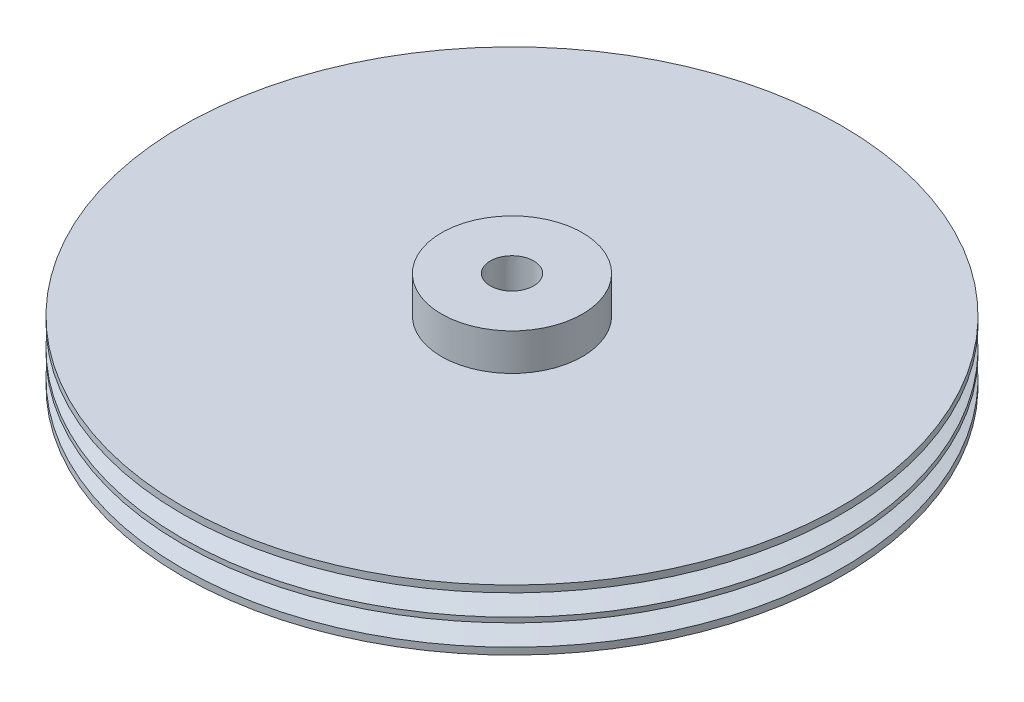
ISO-10303-21;
HEADER;
FILE_DESCRIPTION(('STEP AP214'),'2;1');
FILE_NAME('part.step','',(''),(''),'','','');
FILE_SCHEMA(('AUTOMOTIVE_DESIGN { 1 0 10303 214 1 1 1 1 }'));
ENDSEC;
DATA;
#1=APPLICATION_CONTEXT('core data for automotive mechanical design processes');
#2=APPLICATION_PROTOCOL_DEFINITION('international standard','automotive_design',2000,#1);
#3=PRODUCT_CONTEXT('',#1,'mechanical');
#4=PRODUCT('Part','Part','',(#3));
#5=PRODUCT_RELATED_PRODUCT_CATEGORY('part','',(#4));
#6=PRODUCT_DEFINITION_FORMATION('','',#4);
#7=PRODUCT_DEFINITION_CONTEXT('part definition',#1,'design');
#8=PRODUCT_DEFINITION('design','',#6,#7);
#9=PRODUCT_DEFINITION_SHAPE('','',#8);
#10=(LENGTH_UNIT() NAMED_UNIT(*) SI_UNIT(.MILLI.,.METRE.));
#11=(NAMED_UNIT(*) PLANE_ANGLE_UNIT() SI_UNIT($,.RADIAN.));
#12=(NAMED_UNIT(*) SI_UNIT($,.STERADIAN.) SOLID_ANGLE_UNIT());
#13=UNCERTAINTY_MEASURE_WITH_UNIT(LENGTH_MEASURE(1.E-05),#10,'distance_accuracy_value','');
#14=(GEOMETRIC_REPRESENTATION_CONTEXT(3) GLOBAL_UNCERTAINTY_ASSIGNED_CONTEXT((#13)) GLOBAL_UNIT_ASSIGNED_CONTEXT((#10,
#11,#12)) REPRESENTATION_CONTEXT('',''));
#15=CARTESIAN_POINT('',(0.,0.,0.));
#16=DIRECTION('',(0.,0.,1.));
#17=DIRECTION('',(1.,0.,0.));
#18=AXIS2_PLACEMENT_3D('',#15,#16,#17);
#19=CARTESIAN_POINT('',(10.,0.,0.));
#20=DIRECTION('',(0.,1.,0.));
#21=DIRECTION('',(0.,0.,1.));
#22=AXIS2_PLACEMENT_3D('',#19,#20,#21);
#23=PLANE('',#22);
#24=CARTESIAN_POINT('',(0.,0.,0.));
#25=DIRECTION('',(0.,1.,0.));
#26=DIRECTION('',(0.,0.,1.));
#27=AXIS2_PLACEMENT_3D('',#24,#25,#26);
#28=CIRCLE('',#27,152.);
#29=CARTESIAN_POINT('',(0.,0.,152.));
#30=VERTEX_POINT('',#29);
#31=EDGE_CURVE('E10',#30,#30,#28,.T.);
#32=ORIENTED_EDGE('',*,*,#31,.F.);
#33=EDGE_LOOP('',(#32));
#34=FACE_BOUND('',#33,.T.);
#35=CARTESIAN_POINT('',(0.,0.,0.));
#36=DIRECTION('',(0.,1.,0.));
#37=DIRECTION('',(0.,0.,1.));
#38=AXIS2_PLACEMENT_3D('',#35,#36,#37);
#39=CIRCLE('',#38,10.);
#40=CARTESIAN_POINT('',(0.,0.,10.));
#41=VERTEX_POINT('',#40);
#42=EDGE_CURVE('E78',#41,#41,#39,.T.);
#43=ORIENTED_EDGE('',*,*,#42,.T.);
#44=EDGE_LOOP('',(#43));
#45=FACE_BOUND('',#44,.T.);
#46=ADVANCED_FACE('F32',(#34,#45),#23,.F.);
#47=CARTESIAN_POINT('',(0.,18.7985043090315,0.));
#48=DIRECTION('',(0.,1.,0.));
#49=DIRECTION('',(0.,0.,1.));
#50=AXIS2_PLACEMENT_3D('',#47,#48,#49);
#51=CYLINDRICAL_SURFACE('',#50,152.);
#52=CARTESIAN_POINT('',(0.,3.1385386370827,0.));
#53=DIRECTION('',(0.,1.,0.));
#54=DIRECTION('',(0.,0.,1.));
#55=AXIS2_PLACEMENT_3D('',#52,#53,#54);
#56=CIRCLE('',#55,152.);
#57=CARTESIAN_POINT('',(0.,3.1385386370827,152.));
#58=VERTEX_POINT('',#57);
#59=EDGE_CURVE('E38',#58,#58,#56,.T.);
#60=ORIENTED_EDGE('',*,*,#59,.F.);
#61=EDGE_LOOP('',(#60));
#62=FACE_BOUND('',#61,.T.);
#63=ORIENTED_EDGE('',*,*,#31,.T.);
#64=EDGE_LOOP('',(#63));
#65=FACE_BOUND('',#64,.T.);
#66=ADVANCED_FACE('F151',(#62,#65),#51,.T.);
#67=CARTESIAN_POINT('',(0.,3.1385386370827,0.));
#68=DIRECTION('',(0.,-1.,0.));
#69=DIRECTION('',(0.,0.,-1.));
#70=AXIS2_PLACEMENT_3D('',#67,#68,#69);
#71=CONICAL_SURFACE('',#70,152.,1.27409035395586);
#72=CARTESIAN_POINT('',(0.,6.50157613312794,0.));
#73=DIRECTION('',(0.,1.,0.));
#74=DIRECTION('',(0.,0.,1.));
#75=AXIS2_PLACEMENT_3D('',#72,#73,#74);
#76=CIRCLE('',#75,141.);
#77=CARTESIAN_POINT('',(0.,6.50157613312794,141.));
#78=VERTEX_POINT('',#77);
#79=EDGE_CURVE('E42',#78,#78,#76,.T.);
#80=ORIENTED_EDGE('',*,*,#79,.F.);
#81=EDGE_LOOP('',(#80));
#82=FACE_BOUND('',#81,.T.);
#83=ORIENTED_EDGE('',*,*,#59,.T.);
#84=EDGE_LOOP('',(#83));
#85=FACE_BOUND('',#84,.T.);
#86=ADVANCED_FACE('F146',(#82,#85),#71,.T.);
#87=CARTESIAN_POINT('',(0.,18.7985043090315,0.));
#88=DIRECTION('',(0.,1.,0.));
#89=DIRECTION('',(0.,0.,1.));
#90=AXIS2_PLACEMENT_3D('',#87,#88,#89);
#91=CYLINDRICAL_SURFACE('',#90,141.);
#92=CARTESIAN_POINT('',(0.,9.49842386687209,0.));
#93=DIRECTION('',(0.,1.,0.));
#94=DIRECTION('',(0.,0.,1.));
#95=AXIS2_PLACEMENT_3D('',#92,#93,#94);
#96=CIRCLE('',#95,141.);
#97=CARTESIAN_POINT('',(0.,9.49842386687209,141.));
#98=VERTEX_POINT('',#97);
#99=EDGE_CURVE('E46',#98,#98,#96,.T.);
#100=ORIENTED_EDGE('',*,*,#99,.F.);
#101=EDGE_LOOP('',(#100));
#102=FACE_BOUND('',#101,.T.);
#103=ORIENTED_EDGE('',*,*,#79,.T.);
#104=EDGE_LOOP('',(#103));
#105=FACE_BOUND('',#104,.T.);
#106=ADVANCED_FACE('F140',(#102,#105),#91,.T.);
#107=CARTESIAN_POINT('',(0.,9.49842386687209,0.));
#108=DIRECTION('',(0.,1.,0.));
#109=DIRECTION('',(0.,0.,1.));
#110=AXIS2_PLACEMENT_3D('',#107,#108,#109);
#111=CONICAL_SURFACE('',#110,141.,1.27409035395586);
#112=CARTESIAN_POINT('',(0.,12.8614613629173,0.));
#113=DIRECTION('',(0.,1.,0.));
#114=DIRECTION('',(0.,0.,1.));
#115=AXIS2_PLACEMENT_3D('',#112,#113,#114);
#116=CIRCLE('',#115,152.);
#117=CARTESIAN_POINT('',(0.,12.8614613629173,152.));
#118=VERTEX_POINT('',#117);
#119=EDGE_CURVE('E51',#118,#118,#116,.T.);
#120=ORIENTED_EDGE('',*,*,#119,.F.);
#121=EDGE_LOOP('',(#120));
#122=FACE_BOUND('',#121,.T.);
#123=ORIENTED_EDGE('',*,*,#99,.T.);
#124=EDGE_LOOP('',(#123));
#125=FACE_BOUND('',#124,.T.);
#126=ADVANCED_FACE('F134',(#122,#125),#111,.T.);
#127=CARTESIAN_POINT('',(0.,18.7985043090315,0.));
#128=DIRECTION('',(0.,1.,0.));
#129=DIRECTION('',(0.,0.,1.));
#130=AXIS2_PLACEMENT_3D('',#127,#128,#129);
#131=CYLINDRICAL_SURFACE('',#130,152.);
#132=CARTESIAN_POINT('',(0.,15.1385386370827,0.));
#133=DIRECTION('',(0.,1.,0.));
#134=DIRECTION('',(0.,0.,1.));
#135=AXIS2_PLACEMENT_3D('',#132,#133,#134);
#136=CIRCLE('',#135,152.);
#137=CARTESIAN_POINT('',(0.,15.1385386370827,152.));
#138=VERTEX_POINT('',#137);
#139=EDGE_CURVE('E54',#138,#138,#136,.T.);
#140=ORIENTED_EDGE('',*,*,#139,.F.);
#141=EDGE_LOOP('',(#140));
#142=FACE_BOUND('',#141,.T.);
#143=ORIENTED_EDGE('',*,*,#119,.T.);
#144=EDGE_LOOP('',(#143));
#145=FACE_BOUND('',#144,.T.);
#146=ADVANCED_FACE('F128',(#142,#145),#131,.T.);
#147=CARTESIAN_POINT('',(0.,15.1385386370827,0.));
#148=DIRECTION('',(0.,-1.,0.));
#149=DIRECTION('',(0.,0.,-1.));
#150=AXIS2_PLACEMENT_3D('',#147,#148,#149);
#151=CONICAL_SURFACE('',#150,152.,1.27409035395586);
#152=CARTESIAN_POINT('',(0.,18.5015761331279,0.));
#153=DIRECTION('',(0.,1.,0.));
#154=DIRECTION('',(0.,0.,1.));
#155=AXIS2_PLACEMENT_3D('',#152,#153,#154);
#156=CIRCLE('',#155,141.);
#157=CARTESIAN_POINT('',(0.,18.5015761331279,141.));
#158=VERTEX_POINT('',#157);
#159=EDGE_CURVE('E57',#158,#158,#156,.T.);
#160=ORIENTED_EDGE('',*,*,#159,.F.);
#161=EDGE_LOOP('',(#160));
#162=FACE_BOUND('',#161,.T.);
#163=ORIENTED_EDGE('',*,*,#139,.T.);
#164=EDGE_LOOP('',(#163));
#165=FACE_BOUND('',#164,.T.);
#166=ADVANCED_FACE('F122',(#162,#165),#151,.T.);
#167=CARTESIAN_POINT('',(0.,18.7985043090315,0.));
#168=DIRECTION('',(0.,1.,0.));
#169=DIRECTION('',(0.,0.,1.));
#170=AXIS2_PLACEMENT_3D('',#167,#168,#169);
#171=CYLINDRICAL_SURFACE('',#170,141.);
#172=CARTESIAN_POINT('',(0.,21.4984238668721,0.));
#173=DIRECTION('',(0.,1.,0.));
#174=DIRECTION('',(0.,0.,1.));
#175=AXIS2_PLACEMENT_3D('',#172,#173,#174);
#176=CIRCLE('',#175,141.);
#177=CARTESIAN_POINT('',(0.,21.4984238668721,141.));
#178=VERTEX_POINT('',#177);
#179=EDGE_CURVE('E60',#178,#178,#176,.T.);
#180=ORIENTED_EDGE('',*,*,#179,.F.);
#181=EDGE_LOOP('',(#180));
#182=FACE_BOUND('',#181,.T.);
#183=ORIENTED_EDGE('',*,*,#159,.T.);
#184=EDGE_LOOP('',(#183));
#185=FACE_BOUND('',#184,.T.);
#186=ADVANCED_FACE('F116',(#182,#185),#171,.T.);
#187=CARTESIAN_POINT('',(0.,21.4984238668721,0.));
#188=DIRECTION('',(0.,1.,0.));
#189=DIRECTION('',(0.,0.,1.));
#190=AXIS2_PLACEMENT_3D('',#187,#188,#189);
#191=CONICAL_SURFACE('',#190,141.,1.27409035395586);
#192=CARTESIAN_POINT('',(0.,24.8614613629173,0.));
#193=DIRECTION('',(0.,1.,0.));
#194=DIRECTION('',(0.,0.,1.));
#195=AXIS2_PLACEMENT_3D('',#192,#193,#194);
#196=CIRCLE('',#195,152.);
#197=CARTESIAN_POINT('',(0.,24.8614613629173,152.));
#198=VERTEX_POINT('',#197);
#199=EDGE_CURVE('E63',#198,#198,#196,.T.);
#200=ORIENTED_EDGE('',*,*,#199,.F.);
#201=EDGE_LOOP('',(#200));
#202=FACE_BOUND('',#201,.T.);
#203=ORIENTED_EDGE('',*,*,#179,.T.);
#204=EDGE_LOOP('',(#203));
#205=FACE_BOUND('',#204,.T.);
#206=ADVANCED_FACE('F110',(#202,#205),#191,.T.);
#207=CARTESIAN_POINT('',(0.,18.7985043090315,0.));
#208=DIRECTION('',(0.,1.,0.));
#209=DIRECTION('',(0.,0.,1.));
#210=AXIS2_PLACEMENT_3D('',#207,#208,#209);
#211=CYLINDRICAL_SURFACE('',#210,152.);
#212=CARTESIAN_POINT('',(0.,28.,0.));
#213=DIRECTION('',(0.,1.,0.));
#214=DIRECTION('',(0.,0.,1.));
#215=AXIS2_PLACEMENT_3D('',#212,#213,#214);
#216=CIRCLE('',#215,152.);
#217=CARTESIAN_POINT('',(0.,28.,152.));
#218=VERTEX_POINT('',#217);
#219=EDGE_CURVE('E66',#218,#218,#216,.T.);
#220=ORIENTED_EDGE('',*,*,#219,.F.);
#221=EDGE_LOOP('',(#220));
#222=FACE_BOUND('',#221,.T.);
#223=ORIENTED_EDGE('',*,*,#199,.T.);
#224=EDGE_LOOP('',(#223));
#225=FACE_BOUND('',#224,.T.);
#226=ADVANCED_FACE('F104',(#222,#225),#211,.T.);
#227=CARTESIAN_POINT('',(152.,28.,0.));
#228=DIRECTION('',(0.,-1.,0.));
#229=DIRECTION('',(0.,0.,-1.));
#230=AXIS2_PLACEMENT_3D('',#227,#228,#229);
#231=PLANE('',#230);
#232=CARTESIAN_POINT('',(0.,28.,0.));
#233=DIRECTION('',(0.,1.,0.));
#234=DIRECTION('',(0.,0.,1.));
#235=AXIS2_PLACEMENT_3D('',#232,#233,#234);
#236=CIRCLE('',#235,32.5);
#237=CARTESIAN_POINT('',(0.,28.,32.5));
#238=VERTEX_POINT('',#237);
#239=EDGE_CURVE('E69',#238,#238,#236,.T.);
#240=ORIENTED_EDGE('',*,*,#239,.F.);
#241=EDGE_LOOP('',(#240));
#242=FACE_BOUND('',#241,.T.);
#243=ORIENTED_EDGE('',*,*,#219,.T.);
#244=EDGE_LOOP('',(#243));
#245=FACE_BOUND('',#244,.T.);
#246=ADVANCED_FACE('F98',(#242,#245),#231,.F.);
#247=CARTESIAN_POINT('',(0.,18.7985043090315,0.));
#248=DIRECTION('',(0.,1.,0.));
#249=DIRECTION('',(0.,0.,1.));
#250=AXIS2_PLACEMENT_3D('',#247,#248,#249);
#251=CYLINDRICAL_SURFACE('',#250,32.5);
#252=CARTESIAN_POINT('',(0.,45.,0.));
#253=DIRECTION('',(0.,1.,0.));
#254=DIRECTION('',(0.,0.,1.));
#255=AXIS2_PLACEMENT_3D('',#252,#253,#254);
#256=CIRCLE('',#255,32.5);
#257=CARTESIAN_POINT('',(0.,45.,32.5));
#258=VERTEX_POINT('',#257);
#259=EDGE_CURVE('E72',#258,#258,#256,.T.);
#260=ORIENTED_EDGE('',*,*,#259,.F.);
#261=EDGE_LOOP('',(#260));
#262=FACE_BOUND('',#261,.T.);
#263=ORIENTED_EDGE('',*,*,#239,.T.);
#264=EDGE_LOOP('',(#263));
#265=FACE_BOUND('',#264,.T.);
#266=ADVANCED_FACE('F92',(#262,#265),#251,.T.);
#267=CARTESIAN_POINT('',(32.5,45.,0.));
#268=DIRECTION('',(0.,-1.,0.));
#269=DIRECTION('',(0.,0.,-1.));
#270=AXIS2_PLACEMENT_3D('',#267,#268,#269);
#271=PLANE('',#270);
#272=CARTESIAN_POINT('',(0.,45.,0.));
#273=DIRECTION('',(0.,1.,0.));
#274=DIRECTION('',(0.,0.,1.));
#275=AXIS2_PLACEMENT_3D('',#272,#273,#274);
#276=CIRCLE('',#275,10.);
#277=CARTESIAN_POINT('',(0.,45.,10.));
#278=VERTEX_POINT('',#277);
#279=EDGE_CURVE('E75',#278,#278,#276,.T.);
#280=ORIENTED_EDGE('',*,*,#279,.F.);
#281=EDGE_LOOP('',(#280));
#282=FACE_BOUND('',#281,.T.);
#283=ORIENTED_EDGE('',*,*,#259,.T.);
#284=EDGE_LOOP('',(#283));
#285=FACE_BOUND('',#284,.T.);
#286=ADVANCED_FACE('F86',(#282,#285),#271,.F.);
#287=CARTESIAN_POINT('',(0.,18.7985043090315,0.));
#288=DIRECTION('',(0.,1.,0.));
#289=DIRECTION('',(0.,0.,1.));
#290=AXIS2_PLACEMENT_3D('',#287,#288,#289);
#291=CYLINDRICAL_SURFACE('',#290,10.);
#292=ORIENTED_EDGE('',*,*,#42,.F.);
#293=EDGE_LOOP('',(#292));
#294=FACE_BOUND('',#293,.T.);
#295=ORIENTED_EDGE('',*,*,#279,.T.);
#296=EDGE_LOOP('',(#295));
#297=FACE_BOUND('',#296,.T.);
#298=ADVANCED_FACE('F83',(#294,#297),#291,.F.);
#299=CLOSED_SHELL('',(#46,#66,#86,#106,#126,#146,#166,#186,#206,#226,#246,#266,#286,#298));
#300=MANIFOLD_SOLID_BREP('B2',#299);
#301=ADVANCED_BREP_SHAPE_REPRESENTATION('',(#18,#300),#14);
#302=SHAPE_DEFINITION_REPRESENTATION(#9,#301);
ENDSEC;
END-ISO-10303-21;
